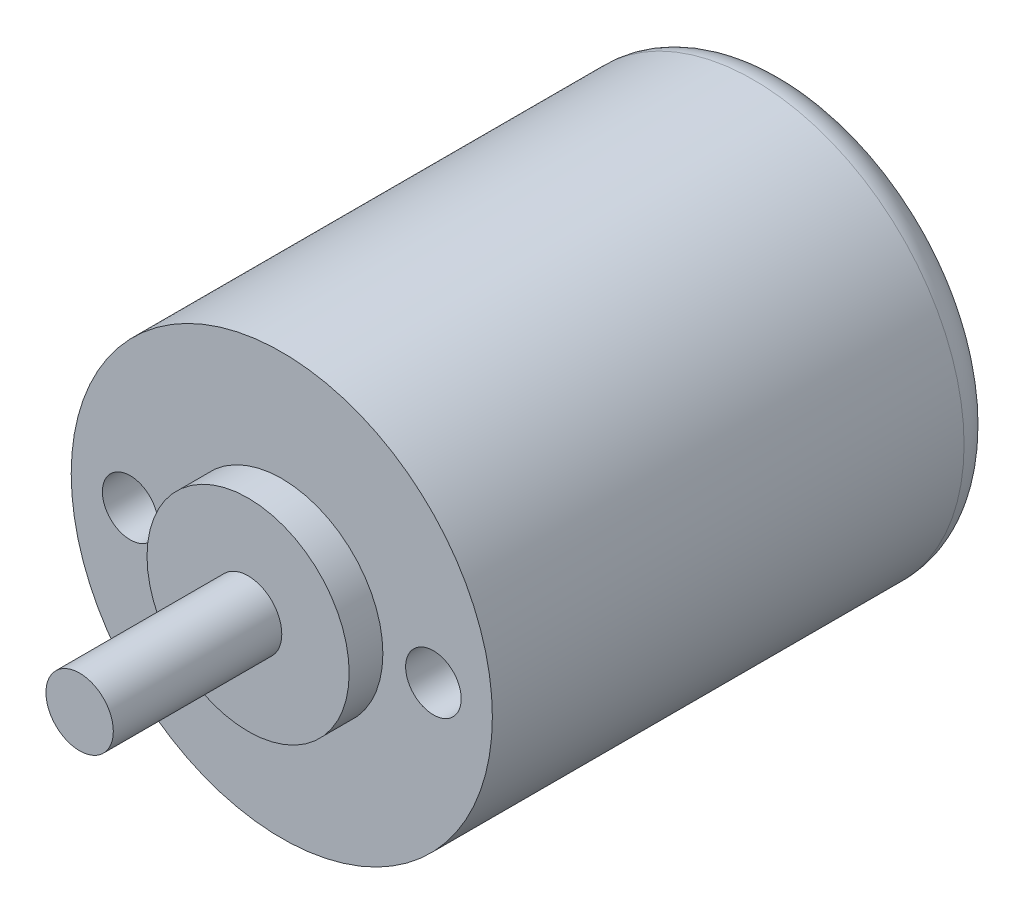
ISO-10303-21;
HEADER;
FILE_DESCRIPTION(('STEP AP214'),'2;1');
FILE_NAME('part.step','',(''),(''),'','','');
FILE_SCHEMA(('AUTOMOTIVE_DESIGN { 1 0 10303 214 1 1 1 1 }'));
ENDSEC;
DATA;
#1=APPLICATION_CONTEXT('core data for automotive mechanical design processes');
#2=APPLICATION_PROTOCOL_DEFINITION('international standard','automotive_design',2000,#1);
#3=PRODUCT_CONTEXT('',#1,'mechanical');
#4=PRODUCT('Part','Part','',(#3));
#5=PRODUCT_RELATED_PRODUCT_CATEGORY('part','',(#4));
#6=PRODUCT_DEFINITION_FORMATION('','',#4);
#7=PRODUCT_DEFINITION_CONTEXT('part definition',#1,'design');
#8=PRODUCT_DEFINITION('design','',#6,#7);
#9=PRODUCT_DEFINITION_SHAPE('','',#8);
#10=(LENGTH_UNIT() NAMED_UNIT(*) SI_UNIT(.MILLI.,.METRE.));
#11=(NAMED_UNIT(*) PLANE_ANGLE_UNIT() SI_UNIT($,.RADIAN.));
#12=(NAMED_UNIT(*) SI_UNIT($,.STERADIAN.) SOLID_ANGLE_UNIT());
#13=UNCERTAINTY_MEASURE_WITH_UNIT(LENGTH_MEASURE(1.E-05),#10,'distance_accuracy_value','');
#14=(GEOMETRIC_REPRESENTATION_CONTEXT(3) GLOBAL_UNCERTAINTY_ASSIGNED_CONTEXT((#13)) GLOBAL_UNIT_ASSIGNED_CONTEXT((#10,
#11,#12)) REPRESENTATION_CONTEXT('',''));
#15=CARTESIAN_POINT('',(0.,0.,0.));
#16=DIRECTION('',(0.,0.,1.));
#17=DIRECTION('',(1.,0.,0.));
#18=AXIS2_PLACEMENT_3D('',#15,#16,#17);
#19=CARTESIAN_POINT('',(0.,0.,30.));
#20=DIRECTION('',(0.,0.,-1.));
#21=DIRECTION('',(-1.,0.,0.));
#22=AXIS2_PLACEMENT_3D('',#19,#20,#21);
#23=CYLINDRICAL_SURFACE('',#22,12.5);
#24=CARTESIAN_POINT('',(0.,0.,2.));
#25=DIRECTION('',(0.,0.,1.));
#26=DIRECTION('',(1.,0.,0.));
#27=AXIS2_PLACEMENT_3D('',#24,#25,#26);
#28=CIRCLE('',#27,12.5);
#29=CARTESIAN_POINT('',(12.5,0.,2.));
#30=VERTEX_POINT('',#29);
#31=EDGE_CURVE('E40',#30,#30,#28,.T.);
#32=ORIENTED_EDGE('',*,*,#31,.T.);
#33=EDGE_LOOP('',(#32));
#34=FACE_BOUND('',#33,.T.);
#35=CARTESIAN_POINT('',(0.,0.,30.));
#36=DIRECTION('',(0.,0.,1.));
#37=DIRECTION('',(1.,0.,0.));
#38=AXIS2_PLACEMENT_3D('',#35,#36,#37);
#39=CIRCLE('',#38,12.5);
#40=CARTESIAN_POINT('',(12.5,0.,30.));
#41=VERTEX_POINT('',#40);
#42=EDGE_CURVE('E44',#41,#41,#39,.T.);
#43=ORIENTED_EDGE('',*,*,#42,.F.);
#44=EDGE_LOOP('',(#43));
#45=FACE_BOUND('',#44,.T.);
#46=ADVANCED_FACE('F33',(#34,#45),#23,.T.);
#47=CARTESIAN_POINT('',(0.,0.,30.));
#48=DIRECTION('',(0.,0.,1.));
#49=DIRECTION('',(1.,0.,0.));
#50=AXIS2_PLACEMENT_3D('',#47,#48,#49);
#51=PLANE('',#50);
#52=CARTESIAN_POINT('',(0.,0.,30.));
#53=DIRECTION('',(0.,0.,1.));
#54=DIRECTION('',(1.,0.,0.));
#55=AXIS2_PLACEMENT_3D('',#52,#53,#54);
#56=CIRCLE('',#55,6.);
#57=CARTESIAN_POINT('',(6.,0.,30.));
#58=VERTEX_POINT('',#57);
#59=EDGE_CURVE('E63',#58,#58,#56,.T.);
#60=ORIENTED_EDGE('',*,*,#59,.F.);
#61=EDGE_LOOP('',(#60));
#62=FACE_BOUND('',#61,.T.);
#63=CARTESIAN_POINT('',(9.,0.,30.));
#64=DIRECTION('',(0.,0.,1.));
#65=DIRECTION('',(1.,0.,0.));
#66=AXIS2_PLACEMENT_3D('',#63,#64,#65);
#67=CIRCLE('',#66,1.65);
#68=CARTESIAN_POINT('',(10.65,0.,30.));
#69=VERTEX_POINT('',#68);
#70=EDGE_CURVE('E57',#69,#69,#67,.T.);
#71=ORIENTED_EDGE('',*,*,#70,.F.);
#72=EDGE_LOOP('',(#71));
#73=FACE_BOUND('',#72,.T.);
#74=CARTESIAN_POINT('',(-9.,0.,30.));
#75=DIRECTION('',(0.,0.,1.));
#76=DIRECTION('',(1.,0.,0.));
#77=AXIS2_PLACEMENT_3D('',#74,#75,#76);
#78=CIRCLE('',#77,1.65);
#79=CARTESIAN_POINT('',(-7.35,0.,30.));
#80=VERTEX_POINT('',#79);
#81=EDGE_CURVE('E51',#80,#80,#78,.T.);
#82=ORIENTED_EDGE('',*,*,#81,.F.);
#83=EDGE_LOOP('',(#82));
#84=FACE_BOUND('',#83,.T.);
#85=ORIENTED_EDGE('',*,*,#42,.T.);
#86=EDGE_LOOP('',(#85));
#87=FACE_BOUND('',#86,.T.);
#88=ADVANCED_FACE('F96',(#62,#73,#84,#87),#51,.T.);
#89=CARTESIAN_POINT('',(0.,0.,0.));
#90=DIRECTION('',(0.,0.,1.));
#91=DIRECTION('',(1.,0.,0.));
#92=AXIS2_PLACEMENT_3D('',#89,#90,#91);
#93=PLANE('',#92);
#94=CARTESIAN_POINT('',(0.,0.,0.));
#95=DIRECTION('',(0.,0.,1.));
#96=DIRECTION('',(1.,0.,0.));
#97=AXIS2_PLACEMENT_3D('',#94,#95,#96);
#98=CIRCLE('',#97,10.5);
#99=CARTESIAN_POINT('',(10.5,0.,0.));
#100=VERTEX_POINT('',#99);
#101=EDGE_CURVE('E10',#100,#100,#98,.F.);
#102=ORIENTED_EDGE('',*,*,#101,.T.);
#103=EDGE_LOOP('',(#102));
#104=FACE_BOUND('',#103,.T.);
#105=ADVANCED_FACE('F99',(#104),#93,.F.);
#106=CARTESIAN_POINT('',(-9.,0.,26.));
#107=DIRECTION('',(0.,0.,1.));
#108=DIRECTION('',(1.,0.,0.));
#109=AXIS2_PLACEMENT_3D('',#106,#107,#108);
#110=CYLINDRICAL_SURFACE('',#109,1.65);
#111=CARTESIAN_POINT('',(-9.,0.,26.));
#112=DIRECTION('',(0.,0.,1.));
#113=DIRECTION('',(1.,0.,0.));
#114=AXIS2_PLACEMENT_3D('',#111,#112,#113);
#115=CIRCLE('',#114,1.65);
#116=CARTESIAN_POINT('',(-7.35,0.,26.));
#117=VERTEX_POINT('',#116);
#118=EDGE_CURVE('E48',#117,#117,#115,.T.);
#119=ORIENTED_EDGE('',*,*,#118,.F.);
#120=EDGE_LOOP('',(#119));
#121=FACE_BOUND('',#120,.T.);
#122=ORIENTED_EDGE('',*,*,#81,.T.);
#123=EDGE_LOOP('',(#122));
#124=FACE_BOUND('',#123,.T.);
#125=ADVANCED_FACE('F112',(#121,#124),#110,.F.);
#126=CARTESIAN_POINT('',(0.,0.,26.));
#127=DIRECTION('',(0.,0.,1.));
#128=DIRECTION('',(1.,0.,0.));
#129=AXIS2_PLACEMENT_3D('',#126,#127,#128);
#130=PLANE('',#129);
#131=ORIENTED_EDGE('',*,*,#118,.T.);
#132=EDGE_LOOP('',(#131));
#133=FACE_BOUND('',#132,.T.);
#134=ADVANCED_FACE('F116',(#133),#130,.T.);
#135=CARTESIAN_POINT('',(9.,0.,26.));
#136=DIRECTION('',(0.,0.,1.));
#137=DIRECTION('',(1.,0.,0.));
#138=AXIS2_PLACEMENT_3D('',#135,#136,#137);
#139=CYLINDRICAL_SURFACE('',#138,1.65);
#140=CARTESIAN_POINT('',(9.,0.,26.));
#141=DIRECTION('',(0.,0.,1.));
#142=DIRECTION('',(1.,0.,0.));
#143=AXIS2_PLACEMENT_3D('',#140,#141,#142);
#144=CIRCLE('',#143,1.65);
#145=CARTESIAN_POINT('',(10.65,0.,26.));
#146=VERTEX_POINT('',#145);
#147=EDGE_CURVE('E54',#146,#146,#144,.T.);
#148=ORIENTED_EDGE('',*,*,#147,.F.);
#149=EDGE_LOOP('',(#148));
#150=FACE_BOUND('',#149,.T.);
#151=ORIENTED_EDGE('',*,*,#70,.T.);
#152=EDGE_LOOP('',(#151));
#153=FACE_BOUND('',#152,.T.);
#154=ADVANCED_FACE('F120',(#150,#153),#139,.F.);
#155=CARTESIAN_POINT('',(0.,0.,26.));
#156=DIRECTION('',(0.,0.,1.));
#157=DIRECTION('',(1.,0.,0.));
#158=AXIS2_PLACEMENT_3D('',#155,#156,#157);
#159=PLANE('',#158);
#160=ORIENTED_EDGE('',*,*,#147,.T.);
#161=EDGE_LOOP('',(#160));
#162=FACE_BOUND('',#161,.T.);
#163=ADVANCED_FACE('F92',(#162),#159,.T.);
#164=CARTESIAN_POINT('',(0.,0.,32.));
#165=DIRECTION('',(0.,0.,-1.));
#166=DIRECTION('',(-1.,0.,0.));
#167=AXIS2_PLACEMENT_3D('',#164,#165,#166);
#168=CYLINDRICAL_SURFACE('',#167,6.);
#169=CARTESIAN_POINT('',(0.,0.,32.));
#170=DIRECTION('',(0.,0.,1.));
#171=DIRECTION('',(1.,0.,0.));
#172=AXIS2_PLACEMENT_3D('',#169,#170,#171);
#173=CIRCLE('',#172,6.);
#174=CARTESIAN_POINT('',(6.,0.,32.));
#175=VERTEX_POINT('',#174);
#176=EDGE_CURVE('E60',#175,#175,#173,.T.);
#177=ORIENTED_EDGE('',*,*,#176,.F.);
#178=EDGE_LOOP('',(#177));
#179=FACE_BOUND('',#178,.T.);
#180=ORIENTED_EDGE('',*,*,#59,.T.);
#181=EDGE_LOOP('',(#180));
#182=FACE_BOUND('',#181,.T.);
#183=ADVANCED_FACE('F86',(#179,#182),#168,.T.);
#184=CARTESIAN_POINT('',(0.,0.,32.));
#185=DIRECTION('',(0.,0.,1.));
#186=DIRECTION('',(1.,0.,0.));
#187=AXIS2_PLACEMENT_3D('',#184,#185,#186);
#188=PLANE('',#187);
#189=CARTESIAN_POINT('',(0.,0.,32.));
#190=DIRECTION('',(0.,0.,1.));
#191=DIRECTION('',(1.,0.,0.));
#192=AXIS2_PLACEMENT_3D('',#189,#190,#191);
#193=CIRCLE('',#192,2.);
#194=CARTESIAN_POINT('',(2.,0.,32.));
#195=VERTEX_POINT('',#194);
#196=EDGE_CURVE('E69',#195,#195,#193,.T.);
#197=ORIENTED_EDGE('',*,*,#196,.F.);
#198=EDGE_LOOP('',(#197));
#199=FACE_BOUND('',#198,.T.);
#200=ORIENTED_EDGE('',*,*,#176,.T.);
#201=EDGE_LOOP('',(#200));
#202=FACE_BOUND('',#201,.T.);
#203=ADVANCED_FACE('F80',(#199,#202),#188,.T.);
#204=CARTESIAN_POINT('',(0.,0.,42.));
#205=DIRECTION('',(0.,0.,-1.));
#206=DIRECTION('',(-1.,0.,0.));
#207=AXIS2_PLACEMENT_3D('',#204,#205,#206);
#208=CYLINDRICAL_SURFACE('',#207,2.);
#209=CARTESIAN_POINT('',(0.,0.,42.));
#210=DIRECTION('',(0.,0.,1.));
#211=DIRECTION('',(1.,0.,0.));
#212=AXIS2_PLACEMENT_3D('',#209,#210,#211);
#213=CIRCLE('',#212,2.);
#214=CARTESIAN_POINT('',(2.,0.,42.));
#215=VERTEX_POINT('',#214);
#216=EDGE_CURVE('E66',#215,#215,#213,.T.);
#217=ORIENTED_EDGE('',*,*,#216,.F.);
#218=EDGE_LOOP('',(#217));
#219=FACE_BOUND('',#218,.T.);
#220=ORIENTED_EDGE('',*,*,#196,.T.);
#221=EDGE_LOOP('',(#220));
#222=FACE_BOUND('',#221,.T.);
#223=ADVANCED_FACE('F77',(#219,#222),#208,.T.);
#224=CARTESIAN_POINT('',(0.,0.,42.));
#225=DIRECTION('',(0.,0.,1.));
#226=DIRECTION('',(1.,0.,0.));
#227=AXIS2_PLACEMENT_3D('',#224,#225,#226);
#228=PLANE('',#227);
#229=ORIENTED_EDGE('',*,*,#216,.T.);
#230=EDGE_LOOP('',(#229));
#231=FACE_BOUND('',#230,.T.);
#232=ADVANCED_FACE('F75',(#231),#228,.T.);
#233=CARTESIAN_POINT('',(0.,0.,2.));
#234=DIRECTION('',(0.,0.,1.));
#235=DIRECTION('',(1.,0.,0.));
#236=AXIS2_PLACEMENT_3D('',#233,#234,#235);
#237=TOROIDAL_SURFACE('',#236,10.5,2.);
#238=ORIENTED_EDGE('',*,*,#101,.F.);
#239=EDGE_LOOP('',(#238));
#240=FACE_BOUND('',#239,.T.);
#241=ORIENTED_EDGE('',*,*,#31,.F.);
#242=EDGE_LOOP('',(#241));
#243=FACE_BOUND('',#242,.T.);
#244=ADVANCED_FACE('F35',(#240,#243),#237,.T.);
#245=CLOSED_SHELL('',(#46,#88,#105,#125,#134,#154,#163,#183,#203,#223,#232,#244));
#246=MANIFOLD_SOLID_BREP('B2',#245);
#247=ADVANCED_BREP_SHAPE_REPRESENTATION('',(#18,#246),#14);
#248=SHAPE_DEFINITION_REPRESENTATION(#9,#247);
ENDSEC;
END-ISO-10303-21;
